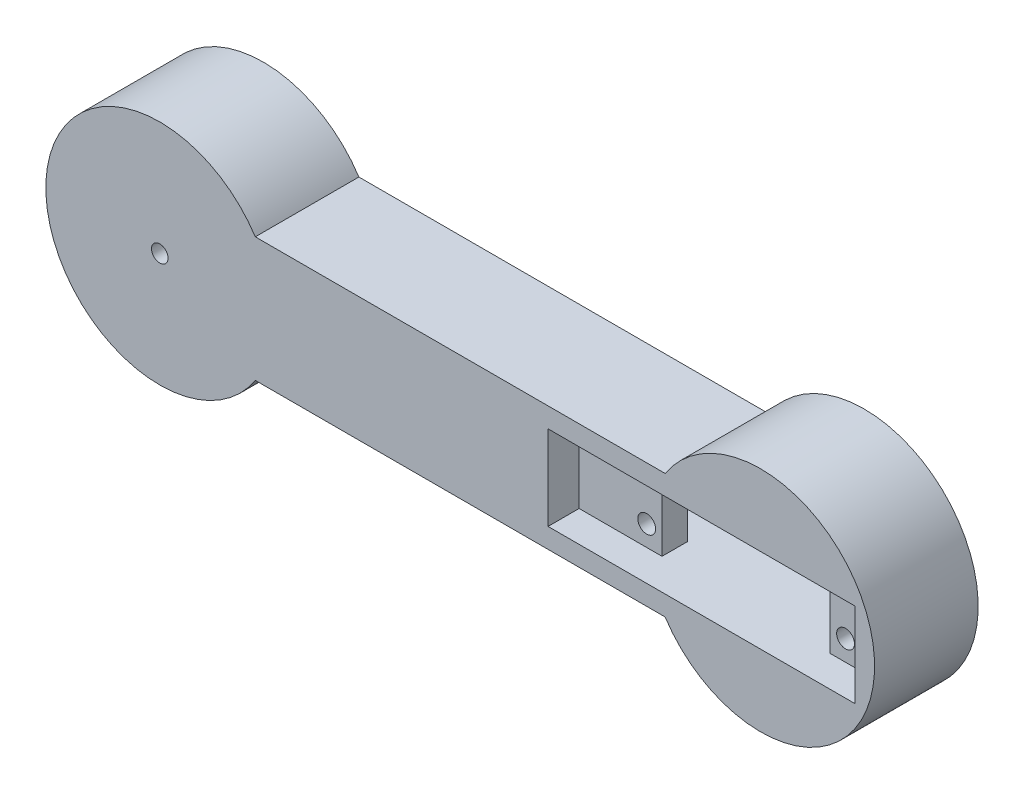
ISO-10303-21;
HEADER;
FILE_DESCRIPTION(('STEP AP214'),'2;1');
FILE_NAME('part.step','',(''),(''),'','','');
FILE_SCHEMA(('AUTOMOTIVE_DESIGN { 1 0 10303 214 1 1 1 1 }'));
ENDSEC;
DATA;
#1=APPLICATION_CONTEXT('core data for automotive mechanical design processes');
#2=APPLICATION_PROTOCOL_DEFINITION('international standard','automotive_design',2000,#1);
#3=PRODUCT_CONTEXT('',#1,'mechanical');
#4=PRODUCT('Part','Part','',(#3));
#5=PRODUCT_RELATED_PRODUCT_CATEGORY('part','',(#4));
#6=PRODUCT_DEFINITION_FORMATION('','',#4);
#7=PRODUCT_DEFINITION_CONTEXT('part definition',#1,'design');
#8=PRODUCT_DEFINITION('design','',#6,#7);
#9=PRODUCT_DEFINITION_SHAPE('','',#8);
#10=(LENGTH_UNIT() NAMED_UNIT(*) SI_UNIT(.MILLI.,.METRE.));
#11=(NAMED_UNIT(*) PLANE_ANGLE_UNIT() SI_UNIT($,.RADIAN.));
#12=(NAMED_UNIT(*) SI_UNIT($,.STERADIAN.) SOLID_ANGLE_UNIT());
#13=UNCERTAINTY_MEASURE_WITH_UNIT(LENGTH_MEASURE(1.E-05),#10,'distance_accuracy_value','');
#14=(GEOMETRIC_REPRESENTATION_CONTEXT(3) GLOBAL_UNCERTAINTY_ASSIGNED_CONTEXT((#13)) GLOBAL_UNIT_ASSIGNED_CONTEXT((#10,
#11,#12)) REPRESENTATION_CONTEXT('',''));
#15=CARTESIAN_POINT('',(0.,0.,0.));
#16=DIRECTION('',(0.,0.,1.));
#17=DIRECTION('',(1.,0.,0.));
#18=AXIS2_PLACEMENT_3D('',#15,#16,#17);
#19=CARTESIAN_POINT('',(0.,0.,11.3));
#20=DIRECTION('',(0.,0.,-1.));
#21=DIRECTION('',(-1.,0.,0.));
#22=AXIS2_PLACEMENT_3D('',#19,#20,#21);
#23=PLANE('',#22);
#24=CARTESIAN_POINT('',(158.,5.25,11.3));
#25=DIRECTION('',(0.,0.,-1.));
#26=DIRECTION('',(-1.,0.,0.));
#27=AXIS2_PLACEMENT_3D('',#24,#25,#26);
#28=CIRCLE('',#27,2.15000000000004);
#29=CARTESIAN_POINT('',(155.85,5.25,11.3));
#30=VERTEX_POINT('',#29);
#31=EDGE_CURVE('E667',#30,#30,#28,.T.);
#32=ORIENTED_EDGE('',*,*,#31,.F.);
#33=EDGE_LOOP('',(#32));
#34=FACE_BOUND('',#33,.T.);
#35=CARTESIAN_POINT('',(158.,-5.25000000000001,11.3));
#36=DIRECTION('',(0.,0.,-1.));
#37=DIRECTION('',(-1.,0.,0.));
#38=AXIS2_PLACEMENT_3D('',#35,#36,#37);
#39=CIRCLE('',#38,2.15000000000004);
#40=CARTESIAN_POINT('',(155.85,-5.25000000000001,11.3));
#41=VERTEX_POINT('',#40);
#42=EDGE_CURVE('E670',#41,#41,#39,.T.);
#43=ORIENTED_EDGE('',*,*,#42,.F.);
#44=EDGE_LOOP('',(#43));
#45=FACE_BOUND('',#44,.T.);
#46=DIRECTION('',(1.,0.,0.));
#47=VECTOR('',#46,1.);
#48=CARTESIAN_POINT('',(0.,-10.2,11.3));
#49=LINE('',#48,#47);
#50=CARTESIAN_POINT('',(154.3,-10.2,11.3));
#51=VERTEX_POINT('',#50);
#52=CARTESIAN_POINT('',(161.25,-10.2,11.3));
#53=VERTEX_POINT('',#52);
#54=EDGE_CURVE('E300',#51,#53,#49,.T.);
#55=ORIENTED_EDGE('',*,*,#54,.F.);
#56=DIRECTION('',(0.,1.,0.));
#57=VECTOR('',#56,1.);
#58=CARTESIAN_POINT('',(154.3,2.09935554778997E-13,11.3));
#59=LINE('',#58,#57);
#60=CARTESIAN_POINT('',(154.3,10.2,11.3));
#61=VERTEX_POINT('',#60);
#62=EDGE_CURVE('E280',#51,#61,#59,.T.);
#63=ORIENTED_EDGE('',*,*,#62,.T.);
#64=DIRECTION('',(1.,0.,0.));
#65=VECTOR('',#64,1.);
#66=CARTESIAN_POINT('',(0.,10.2,11.3));
#67=LINE('',#66,#65);
#68=CARTESIAN_POINT('',(161.25,10.2,11.3));
#69=VERTEX_POINT('',#68);
#70=EDGE_CURVE('E306',#61,#69,#67,.T.);
#71=ORIENTED_EDGE('',*,*,#70,.T.);
#72=DIRECTION('',(0.,-1.,0.));
#73=VECTOR('',#72,1.);
#74=CARTESIAN_POINT('',(161.25,0.,11.3));
#75=LINE('',#74,#73);
#76=EDGE_CURVE('E297',#69,#53,#75,.T.);
#77=ORIENTED_EDGE('',*,*,#76,.T.);
#78=EDGE_LOOP('',(#55,#63,#71,#77));
#79=FACE_BOUND('',#78,.T.);
#80=ADVANCED_FACE('F115',(#34,#45,#79),#23,.T.);
#81=CARTESIAN_POINT('',(0.,0.,25.));
#82=DIRECTION('',(0.,0.,-1.));
#83=DIRECTION('',(-1.,0.,0.));
#84=AXIS2_PLACEMENT_3D('',#81,#82,#83);
#85=CYLINDRICAL_SURFACE('',#84,27.5);
#86=CARTESIAN_POINT('',(0.,0.,0.));
#87=DIRECTION('',(0.,0.,1.));
#88=DIRECTION('',(1.,0.,0.));
#89=AXIS2_PLACEMENT_3D('',#86,#87,#88);
#90=CIRCLE('',#89,27.5);
#91=CARTESIAN_POINT('',(23.0488611432322,15.,0.));
#92=VERTEX_POINT('',#91);
#93=CARTESIAN_POINT('',(23.0488611432322,-15.,0.));
#94=VERTEX_POINT('',#93);
#95=EDGE_CURVE('E338',#92,#94,#90,.T.);
#96=ORIENTED_EDGE('',*,*,#95,.T.);
#97=DIRECTION('',(0.,0.,-1.));
#98=VECTOR('',#97,1.);
#99=CARTESIAN_POINT('',(23.0488611432322,-15.,25.));
#100=LINE('',#99,#98);
#101=CARTESIAN_POINT('',(23.0488611432322,-15.,25.));
#102=VERTEX_POINT('',#101);
#103=EDGE_CURVE('E12',#102,#94,#100,.T.);
#104=ORIENTED_EDGE('',*,*,#103,.F.);
#105=CARTESIAN_POINT('',(0.,0.,25.));
#106=DIRECTION('',(0.,0.,1.));
#107=DIRECTION('',(1.,0.,0.));
#108=AXIS2_PLACEMENT_3D('',#105,#106,#107);
#109=CIRCLE('',#108,27.5);
#110=CARTESIAN_POINT('',(23.0488611432322,15.,25.));
#111=VERTEX_POINT('',#110);
#112=EDGE_CURVE('E341',#111,#102,#109,.T.);
#113=ORIENTED_EDGE('',*,*,#112,.F.);
#114=DIRECTION('',(0.,0.,-1.));
#115=VECTOR('',#114,1.);
#116=CARTESIAN_POINT('',(23.0488611432322,15.,25.));
#117=LINE('',#116,#115);
#118=EDGE_CURVE('E352',#111,#92,#117,.T.);
#119=ORIENTED_EDGE('',*,*,#118,.T.);
#120=EDGE_LOOP('',(#96,#104,#113,#119));
#121=FACE_BOUND('',#120,.T.);
#122=ADVANCED_FACE('F117',(#121),#85,.T.);
#123=CARTESIAN_POINT('',(0.,-15.,25.));
#124=DIRECTION('',(0.,1.,0.));
#125=DIRECTION('',(-1.,0.,0.));
#126=AXIS2_PLACEMENT_3D('',#123,#124,#125);
#127=PLANE('',#126);
#128=DIRECTION('',(1.,0.,0.));
#129=VECTOR('',#128,1.);
#130=CARTESIAN_POINT('',(0.,-15.,0.));
#131=LINE('',#130,#129);
#132=CARTESIAN_POINT('',(121.951138856768,-15.,0.));
#133=VERTEX_POINT('',#132);
#134=EDGE_CURVE('E355',#94,#133,#131,.T.);
#135=ORIENTED_EDGE('',*,*,#134,.T.);
#136=DIRECTION('',(0.,0.,-1.));
#137=VECTOR('',#136,1.);
#138=CARTESIAN_POINT('',(121.951138856768,-15.,25.));
#139=LINE('',#138,#137);
#140=CARTESIAN_POINT('',(121.951138856768,-15.,25.));
#141=VERTEX_POINT('',#140);
#142=EDGE_CURVE('E124',#141,#133,#139,.T.);
#143=ORIENTED_EDGE('',*,*,#142,.F.);
#144=DIRECTION('',(1.,0.,0.));
#145=VECTOR('',#144,1.);
#146=CARTESIAN_POINT('',(0.,-15.,25.));
#147=LINE('',#146,#145);
#148=EDGE_CURVE('E344',#102,#141,#147,.T.);
#149=ORIENTED_EDGE('',*,*,#148,.F.);
#150=ORIENTED_EDGE('',*,*,#103,.T.);
#151=EDGE_LOOP('',(#135,#143,#149,#150));
#152=FACE_BOUND('',#151,.T.);
#153=ADVANCED_FACE('F404',(#152),#127,.F.);
#154=CARTESIAN_POINT('',(145.,0.,25.));
#155=DIRECTION('',(0.,0.,-1.));
#156=DIRECTION('',(-1.,0.,0.));
#157=AXIS2_PLACEMENT_3D('',#154,#155,#156);
#158=CYLINDRICAL_SURFACE('',#157,27.5);
#159=CARTESIAN_POINT('',(145.,0.,0.));
#160=DIRECTION('',(0.,0.,1.));
#161=DIRECTION('',(1.,0.,0.));
#162=AXIS2_PLACEMENT_3D('',#159,#160,#161);
#163=CIRCLE('',#162,27.5);
#164=CARTESIAN_POINT('',(121.951138856768,15.,0.));
#165=VERTEX_POINT('',#164);
#166=EDGE_CURVE('E357',#133,#165,#163,.T.);
#167=ORIENTED_EDGE('',*,*,#166,.T.);
#168=DIRECTION('',(0.,0.,-1.));
#169=VECTOR('',#168,1.);
#170=CARTESIAN_POINT('',(121.951138856768,15.,25.));
#171=LINE('',#170,#169);
#172=CARTESIAN_POINT('',(121.951138856768,15.,25.));
#173=VERTEX_POINT('',#172);
#174=EDGE_CURVE('E363',#173,#165,#171,.T.);
#175=ORIENTED_EDGE('',*,*,#174,.F.);
#176=CARTESIAN_POINT('',(145.,0.,25.));
#177=DIRECTION('',(0.,0.,1.));
#178=DIRECTION('',(1.,0.,0.));
#179=AXIS2_PLACEMENT_3D('',#176,#177,#178);
#180=CIRCLE('',#179,27.5);
#181=EDGE_CURVE('E347',#141,#173,#180,.T.);
#182=ORIENTED_EDGE('',*,*,#181,.F.);
#183=ORIENTED_EDGE('',*,*,#142,.T.);
#184=EDGE_LOOP('',(#167,#175,#182,#183));
#185=FACE_BOUND('',#184,.T.);
#186=ADVANCED_FACE('F456',(#185),#158,.T.);
#187=CARTESIAN_POINT('',(0.,15.,25.));
#188=DIRECTION('',(0.,1.,0.));
#189=DIRECTION('',(-1.,0.,0.));
#190=AXIS2_PLACEMENT_3D('',#187,#188,#189);
#191=PLANE('',#190);
#192=DIRECTION('',(1.,0.,0.));
#193=VECTOR('',#192,1.);
#194=CARTESIAN_POINT('',(0.,15.,0.));
#195=LINE('',#194,#193);
#196=EDGE_CURVE('E345',#92,#165,#195,.T.);
#197=ORIENTED_EDGE('',*,*,#196,.F.);
#198=ORIENTED_EDGE('',*,*,#118,.F.);
#199=DIRECTION('',(1.,0.,0.));
#200=VECTOR('',#199,1.);
#201=CARTESIAN_POINT('',(0.,15.,25.));
#202=LINE('',#201,#200);
#203=EDGE_CURVE('E349',#111,#173,#202,.T.);
#204=ORIENTED_EDGE('',*,*,#203,.T.);
#205=ORIENTED_EDGE('',*,*,#174,.T.);
#206=EDGE_LOOP('',(#197,#198,#204,#205));
#207=FACE_BOUND('',#206,.T.);
#208=ADVANCED_FACE('F450',(#207),#191,.T.);
#209=CARTESIAN_POINT('',(0.,0.,25.));
#210=DIRECTION('',(0.,0.,1.));
#211=DIRECTION('',(1.,0.,0.));
#212=AXIS2_PLACEMENT_3D('',#209,#210,#211);
#213=PLANE('',#212);
#214=DIRECTION('',(-1.,0.,0.));
#215=VECTOR('',#214,1.);
#216=CARTESIAN_POINT('',(0.,-10.2,25.));
#217=LINE('',#216,#215);
#218=CARTESIAN_POINT('',(167.8,-10.2,25.));
#219=VERTEX_POINT('',#218);
#220=CARTESIAN_POINT('',(93.7000000000001,-10.2,25.));
#221=VERTEX_POINT('',#220);
#222=EDGE_CURVE('E283',#219,#221,#217,.T.);
#223=ORIENTED_EDGE('',*,*,#222,.T.);
#224=DIRECTION('',(0.,-1.,0.));
#225=VECTOR('',#224,1.);
#226=CARTESIAN_POINT('',(93.7000000000001,0.,25.));
#227=LINE('',#226,#225);
#228=CARTESIAN_POINT('',(93.7000000000001,10.2,25.));
#229=VERTEX_POINT('',#228);
#230=EDGE_CURVE('E240',#229,#221,#227,.T.);
#231=ORIENTED_EDGE('',*,*,#230,.F.);
#232=DIRECTION('',(1.,0.,0.));
#233=VECTOR('',#232,1.);
#234=CARTESIAN_POINT('',(0.,10.2,25.));
#235=LINE('',#234,#233);
#236=CARTESIAN_POINT('',(167.8,10.2,25.));
#237=VERTEX_POINT('',#236);
#238=EDGE_CURVE('E289',#229,#237,#235,.T.);
#239=ORIENTED_EDGE('',*,*,#238,.T.);
#240=DIRECTION('',(0.,1.,0.));
#241=VECTOR('',#240,1.);
#242=CARTESIAN_POINT('',(167.8,-2.15574018140292E-13,25.));
#243=LINE('',#242,#241);
#244=EDGE_CURVE('E272',#219,#237,#243,.T.);
#245=ORIENTED_EDGE('',*,*,#244,.F.);
#246=EDGE_LOOP('',(#223,#231,#239,#245));
#247=FACE_BOUND('',#246,.T.);
#248=CARTESIAN_POINT('',(0.,0.,25.));
#249=DIRECTION('',(0.,0.,1.));
#250=DIRECTION('',(1.,0.,0.));
#251=AXIS2_PLACEMENT_3D('',#248,#249,#250);
#252=CIRCLE('',#251,2.);
#253=CARTESIAN_POINT('',(2.,0.,25.));
#254=VERTEX_POINT('',#253);
#255=EDGE_CURVE('E323',#254,#254,#252,.T.);
#256=ORIENTED_EDGE('',*,*,#255,.F.);
#257=EDGE_LOOP('',(#256));
#258=FACE_BOUND('',#257,.T.);
#259=ORIENTED_EDGE('',*,*,#112,.T.);
#260=ORIENTED_EDGE('',*,*,#148,.T.);
#261=ORIENTED_EDGE('',*,*,#181,.T.);
#262=ORIENTED_EDGE('',*,*,#203,.F.);
#263=EDGE_LOOP('',(#259,#260,#261,#262));
#264=FACE_BOUND('',#263,.T.);
#265=ADVANCED_FACE('F447',(#247,#258,#264),#213,.T.);
#266=CARTESIAN_POINT('',(0.,0.,0.));
#267=DIRECTION('',(0.,0.,1.));
#268=DIRECTION('',(1.,0.,0.));
#269=AXIS2_PLACEMENT_3D('',#266,#267,#268);
#270=PLANE('',#269);
#271=DIRECTION('',(0.,-1.,0.));
#272=VECTOR('',#271,1.);
#273=CARTESIAN_POINT('',(161.25,0.,0.));
#274=LINE('',#273,#272);
#275=CARTESIAN_POINT('',(161.25,10.2,0.));
#276=VERTEX_POINT('',#275);
#277=CARTESIAN_POINT('',(161.25,-10.2,0.));
#278=VERTEX_POINT('',#277);
#279=EDGE_CURVE('E296',#276,#278,#274,.T.);
#280=ORIENTED_EDGE('',*,*,#279,.F.);
#281=DIRECTION('',(1.,0.,0.));
#282=VECTOR('',#281,1.);
#283=CARTESIAN_POINT('',(0.,10.2,0.));
#284=LINE('',#283,#282);
#285=CARTESIAN_POINT('',(106.75,10.2,0.));
#286=VERTEX_POINT('',#285);
#287=EDGE_CURVE('E301',#286,#276,#284,.T.);
#288=ORIENTED_EDGE('',*,*,#287,.F.);
#289=DIRECTION('',(0.,-1.,0.));
#290=VECTOR('',#289,1.);
#291=CARTESIAN_POINT('',(106.75,0.,0.));
#292=LINE('',#291,#290);
#293=CARTESIAN_POINT('',(106.75,-10.2,0.));
#294=VERTEX_POINT('',#293);
#295=EDGE_CURVE('E316',#286,#294,#292,.T.);
#296=ORIENTED_EDGE('',*,*,#295,.T.);
#297=DIRECTION('',(1.,0.,0.));
#298=VECTOR('',#297,1.);
#299=CARTESIAN_POINT('',(0.,-10.2,0.));
#300=LINE('',#299,#298);
#301=EDGE_CURVE('E313',#294,#278,#300,.T.);
#302=ORIENTED_EDGE('',*,*,#301,.T.);
#303=EDGE_LOOP('',(#280,#288,#296,#302));
#304=FACE_BOUND('',#303,.T.);
#305=CARTESIAN_POINT('',(0.,0.,0.));
#306=DIRECTION('',(0.,0.,-1.));
#307=DIRECTION('',(-1.,0.,0.));
#308=AXIS2_PLACEMENT_3D('',#305,#306,#307);
#309=CIRCLE('',#308,20.0000000000004);
#310=CARTESIAN_POINT('',(-20.0000000000004,0.,0.));
#311=VERTEX_POINT('',#310);
#312=EDGE_CURVE('E334',#311,#311,#309,.T.);
#313=ORIENTED_EDGE('',*,*,#312,.F.);
#314=EDGE_LOOP('',(#313));
#315=FACE_BOUND('',#314,.T.);
#316=ORIENTED_EDGE('',*,*,#95,.F.);
#317=ORIENTED_EDGE('',*,*,#196,.T.);
#318=ORIENTED_EDGE('',*,*,#166,.F.);
#319=ORIENTED_EDGE('',*,*,#134,.F.);
#320=EDGE_LOOP('',(#316,#317,#318,#319));
#321=FACE_BOUND('',#320,.T.);
#322=ADVANCED_FACE('F445',(#304,#315,#321),#270,.F.);
#323=CARTESIAN_POINT('',(0.,0.,5.));
#324=DIRECTION('',(0.,0.,-1.));
#325=DIRECTION('',(-1.,0.,0.));
#326=AXIS2_PLACEMENT_3D('',#323,#324,#325);
#327=CYLINDRICAL_SURFACE('',#326,20.0000000000004);
#328=CARTESIAN_POINT('',(0.,0.,5.));
#329=DIRECTION('',(0.,0.,-1.));
#330=DIRECTION('',(-1.,0.,0.));
#331=AXIS2_PLACEMENT_3D('',#328,#329,#330);
#332=CIRCLE('',#331,20.0000000000004);
#333=CARTESIAN_POINT('',(-20.0000000000004,0.,5.));
#334=VERTEX_POINT('',#333);
#335=EDGE_CURVE('E335',#334,#334,#332,.T.);
#336=ORIENTED_EDGE('',*,*,#335,.F.);
#337=EDGE_LOOP('',(#336));
#338=FACE_BOUND('',#337,.T.);
#339=ORIENTED_EDGE('',*,*,#312,.T.);
#340=EDGE_LOOP('',(#339));
#341=FACE_BOUND('',#340,.T.);
#342=ADVANCED_FACE('F437',(#338,#341),#327,.F.);
#343=CARTESIAN_POINT('',(0.,0.,5.));
#344=DIRECTION('',(0.,0.,-1.));
#345=DIRECTION('',(-1.,0.,0.));
#346=AXIS2_PLACEMENT_3D('',#343,#344,#345);
#347=PLANE('',#346);
#348=CARTESIAN_POINT('',(0.,0.,5.));
#349=DIRECTION('',(0.,0.,-1.));
#350=DIRECTION('',(-1.,0.,0.));
#351=AXIS2_PLACEMENT_3D('',#348,#349,#350);
#352=CIRCLE('',#351,2.);
#353=CARTESIAN_POINT('',(-2.,0.,5.));
#354=VERTEX_POINT('',#353);
#355=EDGE_CURVE('E331',#354,#354,#352,.F.);
#356=ORIENTED_EDGE('',*,*,#355,.T.);
#357=EDGE_LOOP('',(#356));
#358=FACE_BOUND('',#357,.T.);
#359=ORIENTED_EDGE('',*,*,#335,.T.);
#360=EDGE_LOOP('',(#359));
#361=FACE_BOUND('',#360,.T.);
#362=ADVANCED_FACE('F430',(#358,#361),#347,.T.);
#363=CARTESIAN_POINT('',(0.,0.,-0.656854249492387));
#364=DIRECTION('',(0.,0.,1.));
#365=DIRECTION('',(1.,0.,0.));
#366=AXIS2_PLACEMENT_3D('',#363,#364,#365);
#367=CYLINDRICAL_SURFACE('',#366,2.);
#368=ORIENTED_EDGE('',*,*,#255,.T.);
#369=EDGE_LOOP('',(#368));
#370=FACE_BOUND('',#369,.T.);
#371=ORIENTED_EDGE('',*,*,#355,.F.);
#372=EDGE_LOOP('',(#371));
#373=FACE_BOUND('',#372,.T.);
#374=ADVANCED_FACE('F414',(#370,#373),#367,.F.);
#375=CARTESIAN_POINT('',(0.,10.2,11.3));
#376=DIRECTION('',(0.,1.,0.));
#377=DIRECTION('',(0.,0.,1.));
#378=AXIS2_PLACEMENT_3D('',#375,#376,#377);
#379=PLANE('',#378);
#380=CARTESIAN_POINT('',(106.75,10.2,11.3));
#381=VERTEX_POINT('',#380);
#382=CARTESIAN_POINT('',(113.7,10.2,11.3));
#383=VERTEX_POINT('',#382);
#384=EDGE_CURVE('E307',#381,#383,#67,.T.);
#385=ORIENTED_EDGE('',*,*,#384,.F.);
#386=DIRECTION('',(0.,0.,-1.));
#387=VECTOR('',#386,1.);
#388=CARTESIAN_POINT('',(106.75,10.2,11.3));
#389=LINE('',#388,#387);
#390=EDGE_CURVE('E324',#381,#286,#389,.T.);
#391=ORIENTED_EDGE('',*,*,#390,.T.);
#392=ORIENTED_EDGE('',*,*,#287,.T.);
#393=DIRECTION('',(0.,0.,-1.));
#394=VECTOR('',#393,1.);
#395=CARTESIAN_POINT('',(161.25,10.2,11.3));
#396=LINE('',#395,#394);
#397=EDGE_CURVE('E321',#69,#276,#396,.T.);
#398=ORIENTED_EDGE('',*,*,#397,.F.);
#399=ORIENTED_EDGE('',*,*,#70,.F.);
#400=DIRECTION('',(0.,0.,-1.));
#401=VECTOR('',#400,1.);
#402=CARTESIAN_POINT('',(154.3,10.2,70.4369893368828));
#403=LINE('',#402,#401);
#404=CARTESIAN_POINT('',(154.3,10.2,17.5));
#405=VERTEX_POINT('',#404);
#406=EDGE_CURVE('E291',#405,#61,#403,.T.);
#407=ORIENTED_EDGE('',*,*,#406,.F.);
#408=DIRECTION('',(-1.,0.,0.));
#409=VECTOR('',#408,1.);
#410=CARTESIAN_POINT('',(167.8,10.2,17.5));
#411=LINE('',#410,#409);
#412=CARTESIAN_POINT('',(167.8,10.2,17.5));
#413=VERTEX_POINT('',#412);
#414=EDGE_CURVE('E140',#413,#405,#411,.T.);
#415=ORIENTED_EDGE('',*,*,#414,.F.);
#416=DIRECTION('',(0.,0.,-1.));
#417=VECTOR('',#416,1.);
#418=CARTESIAN_POINT('',(167.8,10.2,0.));
#419=LINE('',#418,#417);
#420=EDGE_CURVE('E263',#237,#413,#419,.T.);
#421=ORIENTED_EDGE('',*,*,#420,.F.);
#422=ORIENTED_EDGE('',*,*,#238,.F.);
#423=DIRECTION('',(0.,0.,1.));
#424=VECTOR('',#423,1.);
#425=CARTESIAN_POINT('',(93.7000000000001,10.2,0.));
#426=LINE('',#425,#424);
#427=CARTESIAN_POINT('',(93.7000000000001,10.2,17.5));
#428=VERTEX_POINT('',#427);
#429=EDGE_CURVE('E248',#428,#229,#426,.T.);
#430=ORIENTED_EDGE('',*,*,#429,.F.);
#431=DIRECTION('',(1.,0.,0.));
#432=VECTOR('',#431,1.);
#433=CARTESIAN_POINT('',(93.7000000000001,10.2,17.5));
#434=LINE('',#433,#432);
#435=CARTESIAN_POINT('',(113.7,10.2,17.5));
#436=VERTEX_POINT('',#435);
#437=EDGE_CURVE('E239',#428,#436,#434,.T.);
#438=ORIENTED_EDGE('',*,*,#437,.T.);
#439=DIRECTION('',(0.,0.,-1.));
#440=VECTOR('',#439,1.);
#441=CARTESIAN_POINT('',(113.7,10.2,70.4369893368828));
#442=LINE('',#441,#440);
#443=EDGE_CURVE('E287',#436,#383,#442,.T.);
#444=ORIENTED_EDGE('',*,*,#443,.T.);
#445=EDGE_LOOP('',(#385,#391,#392,#398,#399,#407,#415,#421,#422,#430,#438,#444));
#446=FACE_BOUND('',#445,.T.);
#447=ADVANCED_FACE('F413',(#446),#379,.F.);
#448=CARTESIAN_POINT('',(106.75,0.,11.3));
#449=DIRECTION('',(1.,0.,0.));
#450=DIRECTION('',(0.,0.,-1.));
#451=AXIS2_PLACEMENT_3D('',#448,#449,#450);
#452=PLANE('',#451);
#453=ORIENTED_EDGE('',*,*,#295,.F.);
#454=ORIENTED_EDGE('',*,*,#390,.F.);
#455=DIRECTION('',(0.,-1.,0.));
#456=VECTOR('',#455,1.);
#457=CARTESIAN_POINT('',(106.75,0.,11.3));
#458=LINE('',#457,#456);
#459=CARTESIAN_POINT('',(106.75,-10.2,11.3));
#460=VERTEX_POINT('',#459);
#461=EDGE_CURVE('E304',#381,#460,#458,.T.);
#462=ORIENTED_EDGE('',*,*,#461,.T.);
#463=DIRECTION('',(0.,0.,-1.));
#464=VECTOR('',#463,1.);
#465=CARTESIAN_POINT('',(106.75,-10.2,11.3));
#466=LINE('',#465,#464);
#467=EDGE_CURVE('E326',#460,#294,#466,.T.);
#468=ORIENTED_EDGE('',*,*,#467,.T.);
#469=EDGE_LOOP('',(#453,#454,#462,#468));
#470=FACE_BOUND('',#469,.T.);
#471=ADVANCED_FACE('F427',(#470),#452,.T.);
#472=CARTESIAN_POINT('',(0.,-10.2,11.3));
#473=DIRECTION('',(0.,1.,0.));
#474=DIRECTION('',(0.,0.,1.));
#475=AXIS2_PLACEMENT_3D('',#472,#473,#474);
#476=PLANE('',#475);
#477=ORIENTED_EDGE('',*,*,#301,.F.);
#478=ORIENTED_EDGE('',*,*,#467,.F.);
#479=CARTESIAN_POINT('',(113.7,-10.2,11.3));
#480=VERTEX_POINT('',#479);
#481=EDGE_CURVE('E302',#460,#480,#49,.T.);
#482=ORIENTED_EDGE('',*,*,#481,.T.);
#483=DIRECTION('',(0.,0.,-1.));
#484=VECTOR('',#483,1.);
#485=CARTESIAN_POINT('',(113.7,-10.2,70.4369893368828));
#486=LINE('',#485,#484);
#487=CARTESIAN_POINT('',(113.7,-10.2,17.5));
#488=VERTEX_POINT('',#487);
#489=EDGE_CURVE('E238',#488,#480,#486,.T.);
#490=ORIENTED_EDGE('',*,*,#489,.F.);
#491=DIRECTION('',(1.,0.,0.));
#492=VECTOR('',#491,1.);
#493=CARTESIAN_POINT('',(93.7000000000001,-10.2,17.5));
#494=LINE('',#493,#492);
#495=CARTESIAN_POINT('',(93.7000000000001,-10.2,17.5));
#496=VERTEX_POINT('',#495);
#497=EDGE_CURVE('E132',#496,#488,#494,.T.);
#498=ORIENTED_EDGE('',*,*,#497,.F.);
#499=DIRECTION('',(0.,0.,-1.));
#500=VECTOR('',#499,1.);
#501=CARTESIAN_POINT('',(93.7000000000001,-10.2,0.));
#502=LINE('',#501,#500);
#503=EDGE_CURVE('E235',#221,#496,#502,.T.);
#504=ORIENTED_EDGE('',*,*,#503,.F.);
#505=ORIENTED_EDGE('',*,*,#222,.F.);
#506=DIRECTION('',(0.,0.,1.));
#507=VECTOR('',#506,1.);
#508=CARTESIAN_POINT('',(167.8,-10.2,0.));
#509=LINE('',#508,#507);
#510=CARTESIAN_POINT('',(167.8,-10.2,17.5));
#511=VERTEX_POINT('',#510);
#512=EDGE_CURVE('E269',#511,#219,#509,.T.);
#513=ORIENTED_EDGE('',*,*,#512,.F.);
#514=DIRECTION('',(-1.,0.,0.));
#515=VECTOR('',#514,1.);
#516=CARTESIAN_POINT('',(167.8,-10.2,17.5));
#517=LINE('',#516,#515);
#518=CARTESIAN_POINT('',(154.3,-10.2,17.5));
#519=VERTEX_POINT('',#518);
#520=EDGE_CURVE('E276',#511,#519,#517,.T.);
#521=ORIENTED_EDGE('',*,*,#520,.T.);
#522=DIRECTION('',(0.,0.,-1.));
#523=VECTOR('',#522,1.);
#524=CARTESIAN_POINT('',(154.3,-10.2,70.4369893368828));
#525=LINE('',#524,#523);
#526=EDGE_CURVE('E284',#519,#51,#525,.T.);
#527=ORIENTED_EDGE('',*,*,#526,.T.);
#528=ORIENTED_EDGE('',*,*,#54,.T.);
#529=DIRECTION('',(0.,0.,-1.));
#530=VECTOR('',#529,1.);
#531=CARTESIAN_POINT('',(161.25,-10.2,11.3));
#532=LINE('',#531,#530);
#533=EDGE_CURVE('E310',#53,#278,#532,.T.);
#534=ORIENTED_EDGE('',*,*,#533,.T.);
#535=EDGE_LOOP('',(#477,#478,#482,#490,#498,#504,#505,#513,#521,#527,#528,#534));
#536=FACE_BOUND('',#535,.T.);
#537=ADVANCED_FACE('F233',(#536),#476,.T.);
#538=CARTESIAN_POINT('',(161.25,0.,11.3));
#539=DIRECTION('',(1.,0.,0.));
#540=DIRECTION('',(0.,0.,-1.));
#541=AXIS2_PLACEMENT_3D('',#538,#539,#540);
#542=PLANE('',#541);
#543=ORIENTED_EDGE('',*,*,#279,.T.);
#544=ORIENTED_EDGE('',*,*,#533,.F.);
#545=ORIENTED_EDGE('',*,*,#76,.F.);
#546=ORIENTED_EDGE('',*,*,#397,.T.);
#547=EDGE_LOOP('',(#543,#544,#545,#546));
#548=FACE_BOUND('',#547,.T.);
#549=ADVANCED_FACE('F411',(#548),#542,.F.);
#550=CARTESIAN_POINT('',(110.,-5.25,11.3));
#551=DIRECTION('',(0.,0.,-1.));
#552=DIRECTION('',(-1.,0.,0.));
#553=AXIS2_PLACEMENT_3D('',#550,#551,#552);
#554=CIRCLE('',#553,2.14999999999999);
#555=CARTESIAN_POINT('',(107.85,-5.25,11.3));
#556=VERTEX_POINT('',#555);
#557=EDGE_CURVE('E662',#556,#556,#554,.T.);
#558=ORIENTED_EDGE('',*,*,#557,.F.);
#559=EDGE_LOOP('',(#558));
#560=FACE_BOUND('',#559,.T.);
#561=CARTESIAN_POINT('',(110.,5.25000000000001,11.3));
#562=DIRECTION('',(0.,0.,-1.));
#563=DIRECTION('',(-1.,0.,0.));
#564=AXIS2_PLACEMENT_3D('',#561,#562,#563);
#565=CIRCLE('',#564,2.14999999999999);
#566=CARTESIAN_POINT('',(107.85,5.25000000000001,11.3));
#567=VERTEX_POINT('',#566);
#568=EDGE_CURVE('E256',#567,#567,#565,.T.);
#569=ORIENTED_EDGE('',*,*,#568,.F.);
#570=EDGE_LOOP('',(#569));
#571=FACE_BOUND('',#570,.T.);
#572=DIRECTION('',(0.,1.,0.));
#573=VECTOR('',#572,1.);
#574=CARTESIAN_POINT('',(113.7,0.,11.3));
#575=LINE('',#574,#573);
#576=EDGE_CURVE('E278',#480,#383,#575,.T.);
#577=ORIENTED_EDGE('',*,*,#576,.F.);
#578=ORIENTED_EDGE('',*,*,#481,.F.);
#579=ORIENTED_EDGE('',*,*,#461,.F.);
#580=ORIENTED_EDGE('',*,*,#384,.T.);
#581=EDGE_LOOP('',(#577,#578,#579,#580));
#582=FACE_BOUND('',#581,.T.);
#583=ADVANCED_FACE('F398',(#560,#571,#582),#23,.T.);
#584=CARTESIAN_POINT('',(113.7,0.,70.4369893368828));
#585=DIRECTION('',(-1.,0.,0.));
#586=DIRECTION('',(0.,0.,1.));
#587=AXIS2_PLACEMENT_3D('',#584,#585,#586);
#588=PLANE('',#587);
#589=ORIENTED_EDGE('',*,*,#443,.F.);
#590=DIRECTION('',(0.,1.,0.));
#591=VECTOR('',#590,1.);
#592=CARTESIAN_POINT('',(113.7,0.,17.5));
#593=LINE('',#592,#591);
#594=EDGE_CURVE('E252',#488,#436,#593,.T.);
#595=ORIENTED_EDGE('',*,*,#594,.F.);
#596=ORIENTED_EDGE('',*,*,#489,.T.);
#597=ORIENTED_EDGE('',*,*,#576,.T.);
#598=EDGE_LOOP('',(#589,#595,#596,#597));
#599=FACE_BOUND('',#598,.T.);
#600=ADVANCED_FACE('F410',(#599),#588,.F.);
#601=CARTESIAN_POINT('',(154.3,2.09935554778997E-13,70.4369893368828));
#602=DIRECTION('',(-1.,0.,0.));
#603=DIRECTION('',(0.,-1.,0.));
#604=AXIS2_PLACEMENT_3D('',#601,#602,#603);
#605=PLANE('',#604);
#606=DIRECTION('',(0.,-1.,0.));
#607=VECTOR('',#606,1.);
#608=CARTESIAN_POINT('',(154.3,-1.9430919953061E-13,17.5));
#609=LINE('',#608,#607);
#610=EDGE_CURVE('E261',#405,#519,#609,.T.);
#611=ORIENTED_EDGE('',*,*,#610,.F.);
#612=ORIENTED_EDGE('',*,*,#406,.T.);
#613=ORIENTED_EDGE('',*,*,#62,.F.);
#614=ORIENTED_EDGE('',*,*,#526,.F.);
#615=EDGE_LOOP('',(#611,#612,#613,#614));
#616=FACE_BOUND('',#615,.T.);
#617=ADVANCED_FACE('F419',(#616),#605,.T.);
#618=CARTESIAN_POINT('',(167.8,-2.1304421307116E-13,17.5));
#619=DIRECTION('',(0.,0.,-1.));
#620=DIRECTION('',(0.,1.,0.));
#621=AXIS2_PLACEMENT_3D('',#618,#619,#620);
#622=PLANE('',#621);
#623=CARTESIAN_POINT('',(158.,5.25,17.5));
#624=DIRECTION('',(0.,0.,-1.));
#625=DIRECTION('',(0.,1.,0.));
#626=AXIS2_PLACEMENT_3D('',#623,#624,#625);
#627=CIRCLE('',#626,2.15000000000004);
#628=CARTESIAN_POINT('',(158.,7.40000000000004,17.5));
#629=VERTEX_POINT('',#628);
#630=EDGE_CURVE('E119',#629,#629,#627,.T.);
#631=ORIENTED_EDGE('',*,*,#630,.T.);
#632=EDGE_LOOP('',(#631));
#633=FACE_BOUND('',#632,.T.);
#634=CARTESIAN_POINT('',(158.,-5.25000000000001,17.5));
#635=DIRECTION('',(0.,0.,-1.));
#636=DIRECTION('',(0.,1.,0.));
#637=AXIS2_PLACEMENT_3D('',#634,#635,#636);
#638=CIRCLE('',#637,2.15000000000004);
#639=CARTESIAN_POINT('',(158.,-3.09999999999996,17.5));
#640=VERTEX_POINT('',#639);
#641=EDGE_CURVE('E372',#640,#640,#638,.T.);
#642=ORIENTED_EDGE('',*,*,#641,.T.);
#643=EDGE_LOOP('',(#642));
#644=FACE_BOUND('',#643,.T.);
#645=ORIENTED_EDGE('',*,*,#610,.T.);
#646=ORIENTED_EDGE('',*,*,#520,.F.);
#647=DIRECTION('',(0.,-1.,0.));
#648=VECTOR('',#647,1.);
#649=CARTESIAN_POINT('',(167.8,-2.1304421307116E-13,17.5));
#650=LINE('',#649,#648);
#651=EDGE_CURVE('E266',#413,#511,#650,.T.);
#652=ORIENTED_EDGE('',*,*,#651,.F.);
#653=ORIENTED_EDGE('',*,*,#414,.T.);
#654=EDGE_LOOP('',(#645,#646,#652,#653));
#655=FACE_BOUND('',#654,.T.);
#656=ADVANCED_FACE('F379',(#633,#644,#655),#622,.F.);
#657=CARTESIAN_POINT('',(167.8,-2.15574018140292E-13,0.));
#658=DIRECTION('',(-1.,0.,0.));
#659=DIRECTION('',(0.,-1.,0.));
#660=AXIS2_PLACEMENT_3D('',#657,#658,#659);
#661=PLANE('',#660);
#662=ORIENTED_EDGE('',*,*,#420,.T.);
#663=ORIENTED_EDGE('',*,*,#651,.T.);
#664=ORIENTED_EDGE('',*,*,#512,.T.);
#665=ORIENTED_EDGE('',*,*,#244,.T.);
#666=EDGE_LOOP('',(#662,#663,#664,#665));
#667=FACE_BOUND('',#666,.T.);
#668=ADVANCED_FACE('F603',(#667),#661,.T.);
#669=CARTESIAN_POINT('',(93.7000000000001,0.,17.5));
#670=DIRECTION('',(0.,0.,-1.));
#671=DIRECTION('',(-1.,0.,0.));
#672=AXIS2_PLACEMENT_3D('',#669,#670,#671);
#673=PLANE('',#672);
#674=CARTESIAN_POINT('',(110.,-5.25,17.5));
#675=DIRECTION('',(0.,0.,-1.));
#676=DIRECTION('',(-1.,0.,0.));
#677=AXIS2_PLACEMENT_3D('',#674,#675,#676);
#678=CIRCLE('',#677,2.14999999999999);
#679=CARTESIAN_POINT('',(107.85,-5.25,17.5));
#680=VERTEX_POINT('',#679);
#681=EDGE_CURVE('E370',#680,#680,#678,.T.);
#682=ORIENTED_EDGE('',*,*,#681,.T.);
#683=EDGE_LOOP('',(#682));
#684=FACE_BOUND('',#683,.T.);
#685=CARTESIAN_POINT('',(110.,5.25000000000001,17.5));
#686=DIRECTION('',(0.,0.,-1.));
#687=DIRECTION('',(-1.,0.,0.));
#688=AXIS2_PLACEMENT_3D('',#685,#686,#687);
#689=CIRCLE('',#688,2.14999999999999);
#690=CARTESIAN_POINT('',(107.85,5.25000000000001,17.5));
#691=VERTEX_POINT('',#690);
#692=EDGE_CURVE('E367',#691,#691,#689,.T.);
#693=ORIENTED_EDGE('',*,*,#692,.T.);
#694=EDGE_LOOP('',(#693));
#695=FACE_BOUND('',#694,.T.);
#696=ORIENTED_EDGE('',*,*,#594,.T.);
#697=ORIENTED_EDGE('',*,*,#437,.F.);
#698=DIRECTION('',(0.,1.,0.));
#699=VECTOR('',#698,1.);
#700=CARTESIAN_POINT('',(93.7000000000001,0.,17.5));
#701=LINE('',#700,#699);
#702=EDGE_CURVE('E243',#496,#428,#701,.T.);
#703=ORIENTED_EDGE('',*,*,#702,.F.);
#704=ORIENTED_EDGE('',*,*,#497,.T.);
#705=EDGE_LOOP('',(#696,#697,#703,#704));
#706=FACE_BOUND('',#705,.T.);
#707=ADVANCED_FACE('F244',(#684,#695,#706),#673,.F.);
#708=CARTESIAN_POINT('',(93.7000000000001,0.,0.));
#709=DIRECTION('',(1.,0.,0.));
#710=DIRECTION('',(0.,0.,-1.));
#711=AXIS2_PLACEMENT_3D('',#708,#709,#710);
#712=PLANE('',#711);
#713=ORIENTED_EDGE('',*,*,#503,.T.);
#714=ORIENTED_EDGE('',*,*,#702,.T.);
#715=ORIENTED_EDGE('',*,*,#429,.T.);
#716=ORIENTED_EDGE('',*,*,#230,.T.);
#717=EDGE_LOOP('',(#713,#714,#715,#716));
#718=FACE_BOUND('',#717,.T.);
#719=ADVANCED_FACE('F250',(#718),#712,.T.);
#720=CARTESIAN_POINT('',(110.,5.25000000000001,23.3));
#721=DIRECTION('',(0.,0.,-1.));
#722=DIRECTION('',(-1.,0.,0.));
#723=AXIS2_PLACEMENT_3D('',#720,#721,#722);
#724=CYLINDRICAL_SURFACE('',#723,2.14999999999999);
#725=ORIENTED_EDGE('',*,*,#568,.T.);
#726=EDGE_LOOP('',(#725));
#727=FACE_BOUND('',#726,.T.);
#728=ORIENTED_EDGE('',*,*,#692,.F.);
#729=EDGE_LOOP('',(#728));
#730=FACE_BOUND('',#729,.T.);
#731=ADVANCED_FACE('F629',(#727,#730),#724,.F.);
#732=CARTESIAN_POINT('',(110.,-5.25,23.3));
#733=DIRECTION('',(0.,0.,-1.));
#734=DIRECTION('',(-1.,0.,0.));
#735=AXIS2_PLACEMENT_3D('',#732,#733,#734);
#736=CYLINDRICAL_SURFACE('',#735,2.14999999999999);
#737=ORIENTED_EDGE('',*,*,#557,.T.);
#738=EDGE_LOOP('',(#737));
#739=FACE_BOUND('',#738,.T.);
#740=ORIENTED_EDGE('',*,*,#681,.F.);
#741=EDGE_LOOP('',(#740));
#742=FACE_BOUND('',#741,.T.);
#743=ADVANCED_FACE('F389',(#739,#742),#736,.F.);
#744=CARTESIAN_POINT('',(158.,-5.25000000000001,23.3));
#745=DIRECTION('',(0.,0.,-1.));
#746=DIRECTION('',(-1.,0.,0.));
#747=AXIS2_PLACEMENT_3D('',#744,#745,#746);
#748=CYLINDRICAL_SURFACE('',#747,2.15000000000004);
#749=ORIENTED_EDGE('',*,*,#42,.T.);
#750=EDGE_LOOP('',(#749));
#751=FACE_BOUND('',#750,.T.);
#752=ORIENTED_EDGE('',*,*,#641,.F.);
#753=EDGE_LOOP('',(#752));
#754=FACE_BOUND('',#753,.T.);
#755=ADVANCED_FACE('F383',(#751,#754),#748,.F.);
#756=CARTESIAN_POINT('',(158.,5.25,23.3));
#757=DIRECTION('',(0.,0.,-1.));
#758=DIRECTION('',(-1.,0.,0.));
#759=AXIS2_PLACEMENT_3D('',#756,#757,#758);
#760=CYLINDRICAL_SURFACE('',#759,2.15000000000004);
#761=ORIENTED_EDGE('',*,*,#31,.T.);
#762=EDGE_LOOP('',(#761));
#763=FACE_BOUND('',#762,.T.);
#764=ORIENTED_EDGE('',*,*,#630,.F.);
#765=EDGE_LOOP('',(#764));
#766=FACE_BOUND('',#765,.T.);
#767=ADVANCED_FACE('F381',(#763,#766),#760,.F.);
#768=CLOSED_SHELL('',(#80,#122,#153,#186,#208,#265,#322,#342,#362,#374,#447,#471,#537,#549,#583,
#600,#617,#656,#668,#707,#719,#731,#743,#755,#767));
#769=MANIFOLD_SOLID_BREP('B2',#768);
#770=ADVANCED_BREP_SHAPE_REPRESENTATION('',(#18,#769),#14);
#771=SHAPE_DEFINITION_REPRESENTATION(#9,#770);
ENDSEC;
END-ISO-10303-21;
